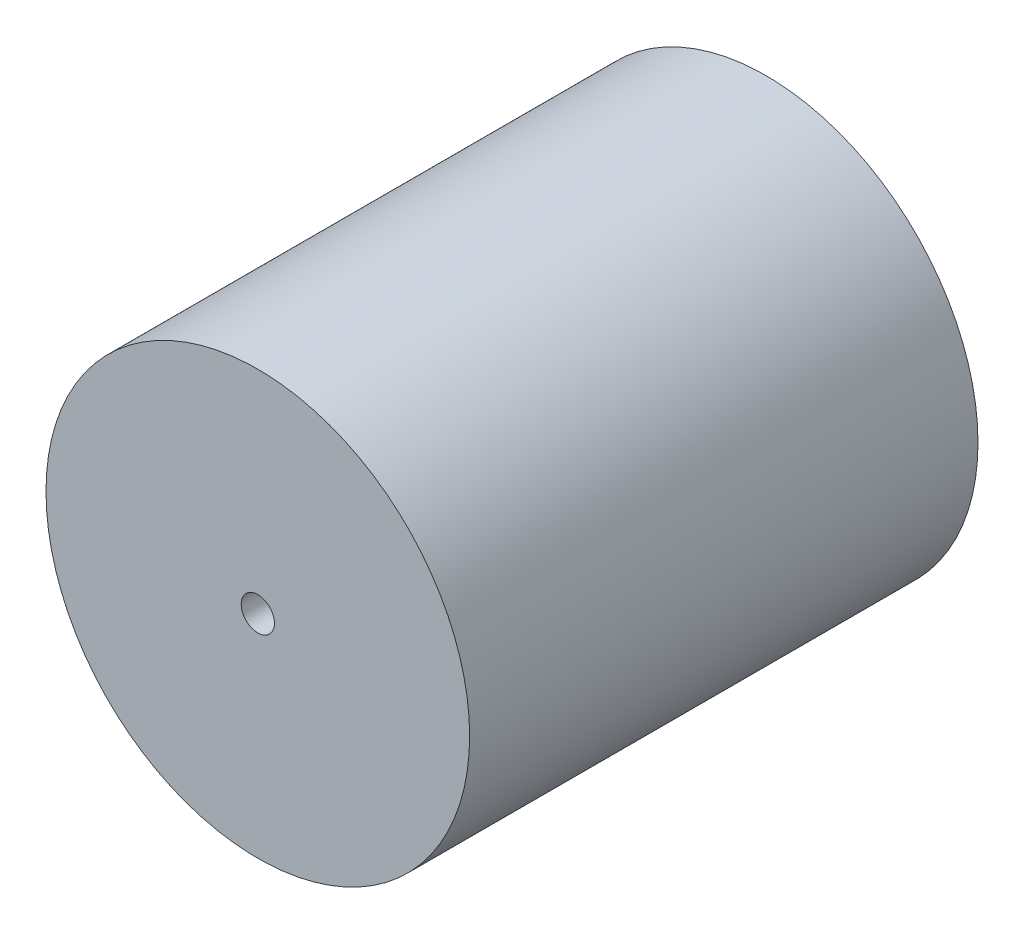
ISO-10303-21;
HEADER;
FILE_DESCRIPTION(('STEP AP214'),'2;1');
FILE_NAME('part.step','',(''),(''),'','','');
FILE_SCHEMA(('AUTOMOTIVE_DESIGN { 1 0 10303 214 1 1 1 1 }'));
ENDSEC;
DATA;
#1=APPLICATION_CONTEXT('core data for automotive mechanical design processes');
#2=APPLICATION_PROTOCOL_DEFINITION('international standard','automotive_design',2000,#1);
#3=PRODUCT_CONTEXT('',#1,'mechanical');
#4=PRODUCT('Part','Part','',(#3));
#5=PRODUCT_RELATED_PRODUCT_CATEGORY('part','',(#4));
#6=PRODUCT_DEFINITION_FORMATION('','',#4);
#7=PRODUCT_DEFINITION_CONTEXT('part definition',#1,'design');
#8=PRODUCT_DEFINITION('design','',#6,#7);
#9=PRODUCT_DEFINITION_SHAPE('','',#8);
#10=(LENGTH_UNIT() NAMED_UNIT(*) SI_UNIT(.MILLI.,.METRE.));
#11=(NAMED_UNIT(*) PLANE_ANGLE_UNIT() SI_UNIT($,.RADIAN.));
#12=(NAMED_UNIT(*) SI_UNIT($,.STERADIAN.) SOLID_ANGLE_UNIT());
#13=UNCERTAINTY_MEASURE_WITH_UNIT(LENGTH_MEASURE(1.E-05),#10,'distance_accuracy_value','');
#14=(GEOMETRIC_REPRESENTATION_CONTEXT(3) GLOBAL_UNCERTAINTY_ASSIGNED_CONTEXT((#13)) GLOBAL_UNIT_ASSIGNED_CONTEXT((#10,
#11,#12)) REPRESENTATION_CONTEXT('',''));
#15=CARTESIAN_POINT('',(0.,0.,0.));
#16=DIRECTION('',(0.,0.,1.));
#17=DIRECTION('',(1.,0.,0.));
#18=AXIS2_PLACEMENT_3D('',#15,#16,#17);
#19=CARTESIAN_POINT('',(28.575,38.1,38.1));
#20=DIRECTION('',(0.,0.,-1.));
#21=DIRECTION('',(-1.,0.,0.));
#22=AXIS2_PLACEMENT_3D('',#19,#20,#21);
#23=CYLINDRICAL_SURFACE('',#22,2.4892);
#24=CARTESIAN_POINT('',(28.575,38.1,38.1));
#25=DIRECTION('',(0.,0.,1.));
#26=DIRECTION('',(1.,0.,0.));
#27=AXIS2_PLACEMENT_3D('',#24,#25,#26);
#28=CIRCLE('',#27,2.4892);
#29=CARTESIAN_POINT('',(26.0858,38.1,38.1));
#30=VERTEX_POINT('',#29);
#31=EDGE_CURVE('E53',#30,#30,#28,.T.);
#32=CARTESIAN_POINT('',(28.575,38.1,-38.1));
#33=DIRECTION('',(0.,0.,1.));
#34=DIRECTION('',(1.,0.,0.));
#35=AXIS2_PLACEMENT_3D('',#32,#33,#34);
#36=CIRCLE('',#35,2.4892);
#37=CARTESIAN_POINT('',(26.0858,38.1,-38.1));
#38=VERTEX_POINT('',#37);
#39=EDGE_CURVE('E60',#38,#38,#36,.T.);
#40=CARTESIAN_POINT('',(26.0858,38.1,38.1));
#41=CARTESIAN_POINT('',(26.0858,38.1,37.30625));
#42=CARTESIAN_POINT('',(26.0858,38.1,36.5125));
#43=CARTESIAN_POINT('',(26.0858,38.1,34.925));
#44=CARTESIAN_POINT('',(26.0858,38.1,34.13125));
#45=CARTESIAN_POINT('',(26.0858,38.1,32.54375));
#46=CARTESIAN_POINT('',(26.0858,38.1,31.75));
#47=CARTESIAN_POINT('',(26.0858,38.1,30.1625));
#48=CARTESIAN_POINT('',(26.0858,38.1,29.36875));
#49=CARTESIAN_POINT('',(26.0858,38.1,27.78125));
#50=CARTESIAN_POINT('',(26.0858,38.1,26.9875));
#51=CARTESIAN_POINT('',(26.0858,38.1,25.4));
#52=CARTESIAN_POINT('',(26.0858,38.1,24.60625));
#53=CARTESIAN_POINT('',(26.0858,38.1,23.01875));
#54=CARTESIAN_POINT('',(26.0858,38.1,22.225));
#55=CARTESIAN_POINT('',(26.0858,38.1,20.6375));
#56=CARTESIAN_POINT('',(26.0858,38.1,19.84375));
#57=CARTESIAN_POINT('',(26.0858,38.1,18.25625));
#58=CARTESIAN_POINT('',(26.0858,38.1,17.4625));
#59=CARTESIAN_POINT('',(26.0858,38.1,15.875));
#60=CARTESIAN_POINT('',(26.0858,38.1,15.08125));
#61=CARTESIAN_POINT('',(26.0858,38.1,13.49375));
#62=CARTESIAN_POINT('',(26.0858,38.1,12.7));
#63=CARTESIAN_POINT('',(26.0858,38.1,11.1125));
#64=CARTESIAN_POINT('',(26.0858,38.1,10.31875));
#65=CARTESIAN_POINT('',(26.0858,38.1,8.73124999999999));
#66=CARTESIAN_POINT('',(26.0858,38.1,7.93749999999999));
#67=CARTESIAN_POINT('',(26.0858,38.1,6.35));
#68=CARTESIAN_POINT('',(26.0858,38.1,5.55625));
#69=CARTESIAN_POINT('',(26.0858,38.1,3.96875));
#70=CARTESIAN_POINT('',(26.0858,38.1,3.175));
#71=CARTESIAN_POINT('',(26.0858,38.1,1.5875));
#72=CARTESIAN_POINT('',(26.0858,38.1,0.793750000000001));
#73=CARTESIAN_POINT('',(26.0858,38.1,-0.793750000000001));
#74=CARTESIAN_POINT('',(26.0858,38.1,-1.5875));
#75=CARTESIAN_POINT('',(26.0858,38.1,-3.175));
#76=CARTESIAN_POINT('',(26.0858,38.1,-3.96875));
#77=CARTESIAN_POINT('',(26.0858,38.1,-5.55625));
#78=CARTESIAN_POINT('',(26.0858,38.1,-6.35));
#79=CARTESIAN_POINT('',(26.0858,38.1,-7.93750000000001));
#80=CARTESIAN_POINT('',(26.0858,38.1,-8.73125));
#81=CARTESIAN_POINT('',(26.0858,38.1,-10.31875));
#82=CARTESIAN_POINT('',(26.0858,38.1,-11.1125));
#83=CARTESIAN_POINT('',(26.0858,38.1,-12.7));
#84=CARTESIAN_POINT('',(26.0858,38.1,-13.49375));
#85=CARTESIAN_POINT('',(26.0858,38.1,-15.08125));
#86=CARTESIAN_POINT('',(26.0858,38.1,-15.875));
#87=CARTESIAN_POINT('',(26.0858,38.1,-17.4625));
#88=CARTESIAN_POINT('',(26.0858,38.1,-18.25625));
#89=CARTESIAN_POINT('',(26.0858,38.1,-19.84375));
#90=CARTESIAN_POINT('',(26.0858,38.1,-20.6375));
#91=CARTESIAN_POINT('',(26.0858,38.1,-22.225));
#92=CARTESIAN_POINT('',(26.0858,38.1,-23.01875));
#93=CARTESIAN_POINT('',(26.0858,38.1,-24.60625));
#94=CARTESIAN_POINT('',(26.0858,38.1,-25.4));
#95=CARTESIAN_POINT('',(26.0858,38.1,-26.9875));
#96=CARTESIAN_POINT('',(26.0858,38.1,-27.78125));
#97=CARTESIAN_POINT('',(26.0858,38.1,-29.36875));
#98=CARTESIAN_POINT('',(26.0858,38.1,-30.1625));
#99=CARTESIAN_POINT('',(26.0858,38.1,-31.75));
#100=CARTESIAN_POINT('',(26.0858,38.1,-32.54375));
#101=CARTESIAN_POINT('',(26.0858,38.1,-34.13125));
#102=CARTESIAN_POINT('',(26.0858,38.1,-34.925));
#103=CARTESIAN_POINT('',(26.0858,38.1,-36.5125));
#104=CARTESIAN_POINT('',(26.0858,38.1,-37.30625));
#105=CARTESIAN_POINT('',(26.0858,38.1,-38.1));
#106=B_SPLINE_CURVE_WITH_KNOTS('',3,(#40,#41,#42,#43,#44,#45,#46,#47,#48,#49,#50,#51,#52,#53,
#54,#55,#56,#57,#58,#59,#60,#61,#62,#63,#64,#65,#66,#67,#68,#69,#70,#71,#72,#73,#74,#75,#76,#77,
#78,#79,#80,#81,#82,#83,#84,#85,#86,#87,#88,#89,#90,#91,#92,#93,#94,#95,#96,#97,#98,#99,#100,
#101,#102,#103,#104,#105),.UNSPECIFIED.,.F.,.F.,(4,2,2,2,2,2,2,2,2,2,2,2,2,2,2,2,2,2,2,2,2,2,2,
2,2,2,2,2,2,2,2,2,4),(0.,2.38125,4.7625,7.14375,9.52500000000001,11.90625,14.2875,16.66875,
19.05,21.43125,23.8125,26.19375,28.575,30.95625,33.3375,35.71875,38.1,40.48125,42.8625,45.24375,
47.625,50.00625,52.3875,54.76875,57.15,59.53125,61.9125,64.29375,66.675,69.05625,71.4375,
73.81875,76.2),.UNSPECIFIED.);
#107=EDGE_CURVE('BSEAM45',#30,#38,#106,.T.);
#108=ORIENTED_EDGE('',*,*,#31,.T.);
#109=ORIENTED_EDGE('',*,*,#39,.F.);
#110=ORIENTED_EDGE('',*,*,#107,.T.);
#111=ORIENTED_EDGE('',*,*,#107,.F.);
#112=EDGE_LOOP('',(#108,#110,#109,#111));
#113=FACE_BOUND('',#112,.T.);
#114=ADVANCED_FACE('F45',(#113),#23,.F.);
#115=CARTESIAN_POINT('',(28.575,38.1,38.1));
#116=DIRECTION('',(0.,0.,-1.));
#117=DIRECTION('',(-1.,0.,0.));
#118=AXIS2_PLACEMENT_3D('',#115,#116,#117);
#119=CYLINDRICAL_SURFACE('',#118,31.75);
#120=CARTESIAN_POINT('',(28.575,38.1,38.1));
#121=DIRECTION('',(0.,0.,1.));
#122=DIRECTION('',(1.,0.,0.));
#123=AXIS2_PLACEMENT_3D('',#120,#121,#122);
#124=CIRCLE('',#123,31.75);
#125=CARTESIAN_POINT('',(-3.175,38.1,38.1));
#126=VERTEX_POINT('',#125);
#127=EDGE_CURVE('E10',#126,#126,#124,.T.);
#128=CARTESIAN_POINT('',(28.575,38.1,-38.1));
#129=DIRECTION('',(0.,0.,1.));
#130=DIRECTION('',(1.,0.,0.));
#131=AXIS2_PLACEMENT_3D('',#128,#129,#130);
#132=CIRCLE('',#131,31.75);
#133=CARTESIAN_POINT('',(-3.175,38.1,-38.1));
#134=VERTEX_POINT('',#133);
#135=EDGE_CURVE('E48',#134,#134,#132,.T.);
#136=CARTESIAN_POINT('',(-3.175,38.1,38.1));
#137=CARTESIAN_POINT('',(-3.175,38.1,37.30625));
#138=CARTESIAN_POINT('',(-3.175,38.1,36.5125));
#139=CARTESIAN_POINT('',(-3.175,38.1,34.925));
#140=CARTESIAN_POINT('',(-3.175,38.1,34.13125));
#141=CARTESIAN_POINT('',(-3.175,38.1,32.54375));
#142=CARTESIAN_POINT('',(-3.175,38.1,31.75));
#143=CARTESIAN_POINT('',(-3.175,38.1,30.1625));
#144=CARTESIAN_POINT('',(-3.175,38.1,29.36875));
#145=CARTESIAN_POINT('',(-3.175,38.1,27.78125));
#146=CARTESIAN_POINT('',(-3.175,38.1,26.9875));
#147=CARTESIAN_POINT('',(-3.175,38.1,25.4));
#148=CARTESIAN_POINT('',(-3.175,38.1,24.60625));
#149=CARTESIAN_POINT('',(-3.175,38.1,23.01875));
#150=CARTESIAN_POINT('',(-3.175,38.1,22.225));
#151=CARTESIAN_POINT('',(-3.175,38.1,20.6375));
#152=CARTESIAN_POINT('',(-3.175,38.1,19.84375));
#153=CARTESIAN_POINT('',(-3.175,38.1,18.25625));
#154=CARTESIAN_POINT('',(-3.175,38.1,17.4625));
#155=CARTESIAN_POINT('',(-3.175,38.1,15.875));
#156=CARTESIAN_POINT('',(-3.175,38.1,15.08125));
#157=CARTESIAN_POINT('',(-3.175,38.1,13.49375));
#158=CARTESIAN_POINT('',(-3.175,38.1,12.7));
#159=CARTESIAN_POINT('',(-3.175,38.1,11.1125));
#160=CARTESIAN_POINT('',(-3.175,38.1,10.31875));
#161=CARTESIAN_POINT('',(-3.175,38.1,8.73124999999999));
#162=CARTESIAN_POINT('',(-3.175,38.1,7.93749999999999));
#163=CARTESIAN_POINT('',(-3.175,38.1,6.34999999999999));
#164=CARTESIAN_POINT('',(-3.175,38.1,5.55625));
#165=CARTESIAN_POINT('',(-3.175,38.1,3.96875));
#166=CARTESIAN_POINT('',(-3.175,38.1,3.17499999999999));
#167=CARTESIAN_POINT('',(-3.175,38.1,1.58749999999999));
#168=CARTESIAN_POINT('',(-3.175,38.1,0.793749999999994));
#169=CARTESIAN_POINT('',(-3.175,38.1,-0.793750000000007));
#170=CARTESIAN_POINT('',(-3.175,38.1,-1.58750000000001));
#171=CARTESIAN_POINT('',(-3.175,38.1,-3.17500000000001));
#172=CARTESIAN_POINT('',(-3.175,38.1,-3.96875000000001));
#173=CARTESIAN_POINT('',(-3.175,38.1,-5.55625000000001));
#174=CARTESIAN_POINT('',(-3.175,38.1,-6.35000000000001));
#175=CARTESIAN_POINT('',(-3.175,38.1,-7.93750000000001));
#176=CARTESIAN_POINT('',(-3.175,38.1,-8.73125000000001));
#177=CARTESIAN_POINT('',(-3.175,38.1,-10.31875));
#178=CARTESIAN_POINT('',(-3.175,38.1,-11.1125));
#179=CARTESIAN_POINT('',(-3.175,38.1,-12.7));
#180=CARTESIAN_POINT('',(-3.175,38.1,-13.49375));
#181=CARTESIAN_POINT('',(-3.175,38.1,-15.08125));
#182=CARTESIAN_POINT('',(-3.175,38.1,-15.875));
#183=CARTESIAN_POINT('',(-3.175,38.1,-17.4625));
#184=CARTESIAN_POINT('',(-3.175,38.1,-18.25625));
#185=CARTESIAN_POINT('',(-3.175,38.1,-19.84375));
#186=CARTESIAN_POINT('',(-3.175,38.1,-20.6375));
#187=CARTESIAN_POINT('',(-3.175,38.1,-22.225));
#188=CARTESIAN_POINT('',(-3.175,38.1,-23.01875));
#189=CARTESIAN_POINT('',(-3.175,38.1,-24.60625));
#190=CARTESIAN_POINT('',(-3.175,38.1,-25.4));
#191=CARTESIAN_POINT('',(-3.175,38.1,-26.9875));
#192=CARTESIAN_POINT('',(-3.175,38.1,-27.78125));
#193=CARTESIAN_POINT('',(-3.175,38.1,-29.36875));
#194=CARTESIAN_POINT('',(-3.175,38.1,-30.1625));
#195=CARTESIAN_POINT('',(-3.175,38.1,-31.75));
#196=CARTESIAN_POINT('',(-3.175,38.1,-32.54375));
#197=CARTESIAN_POINT('',(-3.175,38.1,-34.13125));
#198=CARTESIAN_POINT('',(-3.175,38.1,-34.925));
#199=CARTESIAN_POINT('',(-3.175,38.1,-36.5125));
#200=CARTESIAN_POINT('',(-3.175,38.1,-37.30625));
#201=CARTESIAN_POINT('',(-3.175,38.1,-38.1));
#202=B_SPLINE_CURVE_WITH_KNOTS('',3,(#136,#137,#138,#139,#140,#141,#142,#143,#144,#145,#146,
#147,#148,#149,#150,#151,#152,#153,#154,#155,#156,#157,#158,#159,#160,#161,#162,#163,#164,#165,
#166,#167,#168,#169,#170,#171,#172,#173,#174,#175,#176,#177,#178,#179,#180,#181,#182,#183,#184,
#185,#186,#187,#188,#189,#190,#191,#192,#193,#194,#195,#196,#197,#198,#199,#200,#201),
.UNSPECIFIED.,.F.,.F.,(4,2,2,2,2,2,2,2,2,2,2,2,2,2,2,2,2,2,2,2,2,2,2,2,2,2,2,2,2,2,2,2,4),(0.,
2.38124999999999,4.7625,7.14375,9.525,11.90625,14.2875,16.66875,19.05,21.43125,23.8125,26.19375,
28.575,30.95625,33.3375,35.71875,38.1,40.48125,42.8625,45.24375,47.625,50.00625,52.3875,
54.76875,57.15,59.53125,61.9125,64.29375,66.675,69.05625,71.4375,73.81875,76.2),.UNSPECIFIED.);
#203=EDGE_CURVE('BSEAM69',#126,#134,#202,.T.);
#204=ORIENTED_EDGE('',*,*,#127,.F.);
#205=ORIENTED_EDGE('',*,*,#135,.T.);
#206=ORIENTED_EDGE('',*,*,#203,.T.);
#207=ORIENTED_EDGE('',*,*,#203,.F.);
#208=EDGE_LOOP('',(#204,#206,#205,#207));
#209=FACE_BOUND('',#208,.T.);
#210=ADVANCED_FACE('F69',(#209),#119,.T.);
#211=CARTESIAN_POINT('',(0.,0.,38.1));
#212=DIRECTION('',(0.,0.,1.));
#213=DIRECTION('',(1.,0.,0.));
#214=AXIS2_PLACEMENT_3D('',#211,#212,#213);
#215=PLANE('',#214);
#216=ORIENTED_EDGE('',*,*,#31,.F.);
#217=EDGE_LOOP('',(#216));
#218=FACE_BOUND('',#217,.T.);
#219=ORIENTED_EDGE('',*,*,#127,.T.);
#220=EDGE_LOOP('',(#219));
#221=FACE_BOUND('',#220,.T.);
#222=ADVANCED_FACE('F73',(#218,#221),#215,.T.);
#223=CARTESIAN_POINT('',(0.,0.,-38.1));
#224=DIRECTION('',(0.,0.,1.));
#225=DIRECTION('',(1.,0.,0.));
#226=AXIS2_PLACEMENT_3D('',#223,#224,#225);
#227=PLANE('',#226);
#228=ORIENTED_EDGE('',*,*,#39,.T.);
#229=EDGE_LOOP('',(#228));
#230=FACE_BOUND('',#229,.T.);
#231=ORIENTED_EDGE('',*,*,#135,.F.);
#232=EDGE_LOOP('',(#231));
#233=FACE_BOUND('',#232,.T.);
#234=ADVANCED_FACE('F71',(#230,#233),#227,.F.);
#235=CLOSED_SHELL('',(#114,#210,#222,#234));
#236=MANIFOLD_SOLID_BREP('B2',#235);
#237=ADVANCED_BREP_SHAPE_REPRESENTATION('',(#18,#236),#14);
#238=SHAPE_DEFINITION_REPRESENTATION(#9,#237);
ENDSEC;
END-ISO-10303-21;
